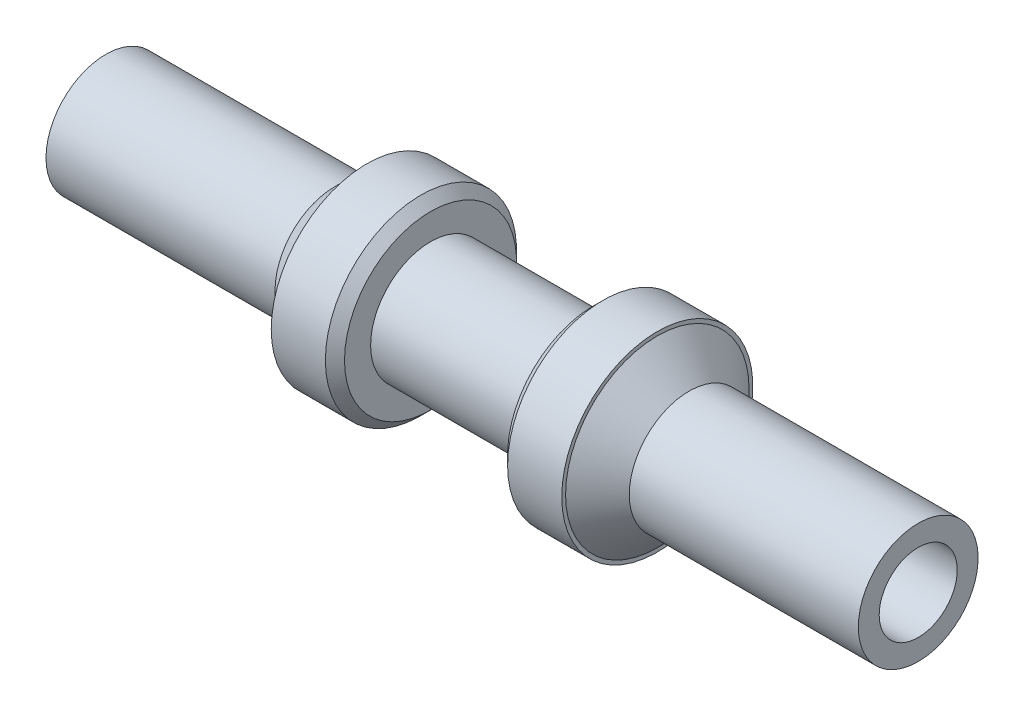
ISO-10303-21;
HEADER;
FILE_DESCRIPTION(('STEP AP214'),'2;1');
FILE_NAME('part.step','',(''),(''),'','','');
FILE_SCHEMA(('AUTOMOTIVE_DESIGN { 1 0 10303 214 1 1 1 1 }'));
ENDSEC;
DATA;
#1=APPLICATION_CONTEXT('core data for automotive mechanical design processes');
#2=APPLICATION_PROTOCOL_DEFINITION('international standard','automotive_design',2000,#1);
#3=PRODUCT_CONTEXT('',#1,'mechanical');
#4=PRODUCT('Part','Part','',(#3));
#5=PRODUCT_RELATED_PRODUCT_CATEGORY('part','',(#4));
#6=PRODUCT_DEFINITION_FORMATION('','',#4);
#7=PRODUCT_DEFINITION_CONTEXT('part definition',#1,'design');
#8=PRODUCT_DEFINITION('design','',#6,#7);
#9=PRODUCT_DEFINITION_SHAPE('','',#8);
#10=(LENGTH_UNIT() NAMED_UNIT(*) SI_UNIT(.MILLI.,.METRE.));
#11=(NAMED_UNIT(*) PLANE_ANGLE_UNIT() SI_UNIT($,.RADIAN.));
#12=(NAMED_UNIT(*) SI_UNIT($,.STERADIAN.) SOLID_ANGLE_UNIT());
#13=UNCERTAINTY_MEASURE_WITH_UNIT(LENGTH_MEASURE(1.E-05),#10,'distance_accuracy_value','');
#14=(GEOMETRIC_REPRESENTATION_CONTEXT(3) GLOBAL_UNCERTAINTY_ASSIGNED_CONTEXT((#13)) GLOBAL_UNIT_ASSIGNED_CONTEXT((#10,
#11,#12)) REPRESENTATION_CONTEXT('',''));
#15=CARTESIAN_POINT('',(0.,0.,0.));
#16=DIRECTION('',(0.,0.,1.));
#17=DIRECTION('',(1.,0.,0.));
#18=AXIS2_PLACEMENT_3D('',#15,#16,#17);
#19=CARTESIAN_POINT('',(0.,0.,0.));
#20=DIRECTION('',(-1.,0.,0.));
#21=DIRECTION('',(0.,0.,1.));
#22=AXIS2_PLACEMENT_3D('',#19,#20,#21);
#23=CYLINDRICAL_SURFACE('',#22,3.1115);
#24=CARTESIAN_POINT('',(64.77,0.,0.));
#25=DIRECTION('',(-1.,0.,0.));
#26=DIRECTION('',(0.,0.,1.));
#27=AXIS2_PLACEMENT_3D('',#24,#25,#26);
#28=CIRCLE('',#27,3.1115);
#29=CARTESIAN_POINT('',(64.77,0.,3.1115));
#30=VERTEX_POINT('',#29);
#31=EDGE_CURVE('E111',#30,#30,#28,.T.);
#32=ORIENTED_EDGE('',*,*,#31,.F.);
#33=EDGE_LOOP('',(#32));
#34=FACE_BOUND('',#33,.T.);
#35=CARTESIAN_POINT('',(0.,0.,0.));
#36=DIRECTION('',(-1.,0.,0.));
#37=DIRECTION('',(0.,0.,1.));
#38=AXIS2_PLACEMENT_3D('',#35,#36,#37);
#39=CIRCLE('',#38,3.1115);
#40=CARTESIAN_POINT('',(0.,0.,3.1115));
#41=VERTEX_POINT('',#40);
#42=EDGE_CURVE('E88',#41,#41,#39,.T.);
#43=ORIENTED_EDGE('',*,*,#42,.T.);
#44=EDGE_LOOP('',(#43));
#45=FACE_BOUND('',#44,.T.);
#46=ADVANCED_FACE('F44',(#34,#45),#23,.F.);
#47=CARTESIAN_POINT('',(0.,3.1115,0.));
#48=DIRECTION('',(1.,0.,0.));
#49=DIRECTION('',(0.,0.,-1.));
#50=AXIS2_PLACEMENT_3D('',#47,#48,#49);
#51=PLANE('',#50);
#52=ORIENTED_EDGE('',*,*,#42,.F.);
#53=EDGE_LOOP('',(#52));
#54=FACE_BOUND('',#53,.T.);
#55=CARTESIAN_POINT('',(0.,0.,0.));
#56=DIRECTION('',(-1.,0.,0.));
#57=DIRECTION('',(0.,0.,1.));
#58=AXIS2_PLACEMENT_3D('',#55,#56,#57);
#59=CIRCLE('',#58,4.7752);
#60=CARTESIAN_POINT('',(0.,0.,4.7752));
#61=VERTEX_POINT('',#60);
#62=EDGE_CURVE('E89',#61,#61,#59,.T.);
#63=ORIENTED_EDGE('',*,*,#62,.T.);
#64=EDGE_LOOP('',(#63));
#65=FACE_BOUND('',#64,.T.);
#66=ADVANCED_FACE('F121',(#54,#65),#51,.F.);
#67=CARTESIAN_POINT('',(0.,0.,0.));
#68=DIRECTION('',(-1.,0.,0.));
#69=DIRECTION('',(0.,0.,1.));
#70=AXIS2_PLACEMENT_3D('',#67,#68,#69);
#71=CYLINDRICAL_SURFACE('',#70,4.7752);
#72=CARTESIAN_POINT('',(18.2626,0.,0.));
#73=DIRECTION('',(1.,0.,0.));
#74=DIRECTION('',(0.,0.,-1.));
#75=AXIS2_PLACEMENT_3D('',#72,#73,#74);
#76=CIRCLE('',#75,4.7752);
#77=CARTESIAN_POINT('',(18.2626,0.,-4.7752));
#78=VERTEX_POINT('',#77);
#79=EDGE_CURVE('E63',#78,#78,#76,.F.);
#80=ORIENTED_EDGE('',*,*,#79,.T.);
#81=EDGE_LOOP('',(#80));
#82=FACE_BOUND('',#81,.T.);
#83=ORIENTED_EDGE('',*,*,#62,.F.);
#84=EDGE_LOOP('',(#83));
#85=FACE_BOUND('',#84,.T.);
#86=ADVANCED_FACE('F129',(#82,#85),#71,.T.);
#87=CARTESIAN_POINT('',(20.8026,4.7752,0.));
#88=DIRECTION('',(1.,0.,0.));
#89=DIRECTION('',(0.,0.,-1.));
#90=AXIS2_PLACEMENT_3D('',#87,#88,#89);
#91=PLANE('',#90);
#92=CARTESIAN_POINT('',(20.8026,0.,0.));
#93=DIRECTION('',(1.,0.,0.));
#94=DIRECTION('',(0.,0.,-1.));
#95=AXIS2_PLACEMENT_3D('',#92,#93,#94);
#96=CIRCLE('',#95,7.3152);
#97=CARTESIAN_POINT('',(20.8026,0.,-7.3152));
#98=VERTEX_POINT('',#97);
#99=EDGE_CURVE('E56',#98,#98,#96,.T.);
#100=ORIENTED_EDGE('',*,*,#99,.T.);
#101=EDGE_LOOP('',(#100));
#102=FACE_BOUND('',#101,.T.);
#103=CARTESIAN_POINT('',(20.8026,0.,0.));
#104=DIRECTION('',(-1.,0.,0.));
#105=DIRECTION('',(0.,0.,1.));
#106=AXIS2_PLACEMENT_3D('',#103,#104,#105);
#107=CIRCLE('',#106,7.62);
#108=CARTESIAN_POINT('',(20.8026,0.,7.62));
#109=VERTEX_POINT('',#108);
#110=EDGE_CURVE('E94',#109,#109,#107,.T.);
#111=ORIENTED_EDGE('',*,*,#110,.T.);
#112=EDGE_LOOP('',(#111));
#113=FACE_BOUND('',#112,.T.);
#114=ADVANCED_FACE('F133',(#102,#113),#91,.F.);
#115=CARTESIAN_POINT('',(0.,0.,0.));
#116=DIRECTION('',(-1.,0.,0.));
#117=DIRECTION('',(0.,0.,1.));
#118=AXIS2_PLACEMENT_3D('',#115,#116,#117);
#119=CYLINDRICAL_SURFACE('',#118,7.62);
#120=CARTESIAN_POINT('',(25.1206,0.,0.));
#121=DIRECTION('',(-1.,0.,0.));
#122=DIRECTION('',(0.,0.,1.));
#123=AXIS2_PLACEMENT_3D('',#120,#121,#122);
#124=CIRCLE('',#123,7.62);
#125=CARTESIAN_POINT('',(25.1206,0.,7.62));
#126=VERTEX_POINT('',#125);
#127=EDGE_CURVE('E74',#126,#126,#124,.T.);
#128=ORIENTED_EDGE('',*,*,#127,.T.);
#129=EDGE_LOOP('',(#128));
#130=FACE_BOUND('',#129,.T.);
#131=ORIENTED_EDGE('',*,*,#110,.F.);
#132=EDGE_LOOP('',(#131));
#133=FACE_BOUND('',#132,.T.);
#134=ADVANCED_FACE('F143',(#130,#133),#119,.T.);
#135=CARTESIAN_POINT('',(25.8826,7.62,0.));
#136=DIRECTION('',(-1.,0.,0.));
#137=DIRECTION('',(0.,0.,1.));
#138=AXIS2_PLACEMENT_3D('',#135,#136,#137);
#139=PLANE('',#138);
#140=CARTESIAN_POINT('',(25.8826,0.,0.));
#141=DIRECTION('',(-1.,0.,0.));
#142=DIRECTION('',(0.,0.,1.));
#143=AXIS2_PLACEMENT_3D('',#140,#141,#142);
#144=CIRCLE('',#143,6.85800000000001);
#145=CARTESIAN_POINT('',(25.8826,0.,6.85800000000001));
#146=VERTEX_POINT('',#145);
#147=EDGE_CURVE('E69',#146,#146,#144,.F.);
#148=ORIENTED_EDGE('',*,*,#147,.T.);
#149=EDGE_LOOP('',(#148));
#150=FACE_BOUND('',#149,.T.);
#151=CARTESIAN_POINT('',(25.8826,0.,0.));
#152=DIRECTION('',(-1.,0.,0.));
#153=DIRECTION('',(0.,0.,1.));
#154=AXIS2_PLACEMENT_3D('',#151,#152,#153);
#155=CIRCLE('',#154,4.7752);
#156=CARTESIAN_POINT('',(25.8826,0.,4.7752));
#157=VERTEX_POINT('',#156);
#158=EDGE_CURVE('E98',#157,#157,#155,.T.);
#159=ORIENTED_EDGE('',*,*,#158,.T.);
#160=EDGE_LOOP('',(#159));
#161=FACE_BOUND('',#160,.T.);
#162=ADVANCED_FACE('F178',(#150,#161),#139,.F.);
#163=CARTESIAN_POINT('',(0.,0.,0.));
#164=DIRECTION('',(-1.,0.,0.));
#165=DIRECTION('',(0.,0.,1.));
#166=AXIS2_PLACEMENT_3D('',#163,#164,#165);
#167=CYLINDRICAL_SURFACE('',#166,4.7752);
#168=ORIENTED_EDGE('',*,*,#158,.F.);
#169=EDGE_LOOP('',(#168));
#170=FACE_BOUND('',#169,.T.);
#171=CARTESIAN_POINT('',(38.8874,0.,0.));
#172=DIRECTION('',(-1.,0.,0.));
#173=DIRECTION('',(0.,0.,1.));
#174=AXIS2_PLACEMENT_3D('',#171,#172,#173);
#175=CIRCLE('',#174,4.7752);
#176=CARTESIAN_POINT('',(38.8874,0.,4.7752));
#177=VERTEX_POINT('',#176);
#178=EDGE_CURVE('E105',#177,#177,#175,.T.);
#179=ORIENTED_EDGE('',*,*,#178,.T.);
#180=EDGE_LOOP('',(#179));
#181=FACE_BOUND('',#180,.T.);
#182=ADVANCED_FACE('F185',(#170,#181),#167,.T.);
#183=CARTESIAN_POINT('',(38.8874,4.7752,0.));
#184=DIRECTION('',(1.,0.,0.));
#185=DIRECTION('',(0.,0.,-1.));
#186=AXIS2_PLACEMENT_3D('',#183,#184,#185);
#187=PLANE('',#186);
#188=CARTESIAN_POINT('',(38.8874,0.,0.));
#189=DIRECTION('',(1.,0.,0.));
#190=DIRECTION('',(0.,0.,-1.));
#191=AXIS2_PLACEMENT_3D('',#188,#189,#190);
#192=CIRCLE('',#191,6.85799999999999);
#193=CARTESIAN_POINT('',(38.8874,0.,-6.85799999999999));
#194=VERTEX_POINT('',#193);
#195=EDGE_CURVE('E85',#194,#194,#192,.F.);
#196=ORIENTED_EDGE('',*,*,#195,.T.);
#197=EDGE_LOOP('',(#196));
#198=FACE_BOUND('',#197,.T.);
#199=ORIENTED_EDGE('',*,*,#178,.F.);
#200=EDGE_LOOP('',(#199));
#201=FACE_BOUND('',#200,.T.);
#202=ADVANCED_FACE('F190',(#198,#201),#187,.F.);
#203=CARTESIAN_POINT('',(0.,0.,0.));
#204=DIRECTION('',(-1.,0.,0.));
#205=DIRECTION('',(0.,0.,1.));
#206=AXIS2_PLACEMENT_3D('',#203,#204,#205);
#207=CYLINDRICAL_SURFACE('',#206,7.62);
#208=CARTESIAN_POINT('',(39.6494,0.,0.));
#209=DIRECTION('',(1.,0.,0.));
#210=DIRECTION('',(0.,0.,-1.));
#211=AXIS2_PLACEMENT_3D('',#208,#209,#210);
#212=CIRCLE('',#211,7.62);
#213=CARTESIAN_POINT('',(39.6494,0.,-7.62));
#214=VERTEX_POINT('',#213);
#215=EDGE_CURVE('E80',#214,#214,#212,.T.);
#216=ORIENTED_EDGE('',*,*,#215,.T.);
#217=EDGE_LOOP('',(#216));
#218=FACE_BOUND('',#217,.T.);
#219=CARTESIAN_POINT('',(43.9674,0.,0.));
#220=DIRECTION('',(-1.,0.,0.));
#221=DIRECTION('',(0.,0.,1.));
#222=AXIS2_PLACEMENT_3D('',#219,#220,#221);
#223=CIRCLE('',#222,7.62);
#224=CARTESIAN_POINT('',(43.9674,0.,7.62));
#225=VERTEX_POINT('',#224);
#226=EDGE_CURVE('E106',#225,#225,#223,.T.);
#227=ORIENTED_EDGE('',*,*,#226,.T.);
#228=EDGE_LOOP('',(#227));
#229=FACE_BOUND('',#228,.T.);
#230=ADVANCED_FACE('F195',(#218,#229),#207,.T.);
#231=CARTESIAN_POINT('',(43.9674,7.62,0.));
#232=DIRECTION('',(-1.,0.,0.));
#233=DIRECTION('',(0.,0.,1.));
#234=AXIS2_PLACEMENT_3D('',#231,#232,#233);
#235=PLANE('',#234);
#236=CARTESIAN_POINT('',(43.9674,0.,0.));
#237=DIRECTION('',(-1.,0.,0.));
#238=DIRECTION('',(0.,0.,1.));
#239=AXIS2_PLACEMENT_3D('',#236,#237,#238);
#240=CIRCLE('',#239,7.31520000000004);
#241=CARTESIAN_POINT('',(43.9674,0.,7.31520000000004));
#242=VERTEX_POINT('',#241);
#243=EDGE_CURVE('E53',#242,#242,#240,.T.);
#244=ORIENTED_EDGE('',*,*,#243,.T.);
#245=EDGE_LOOP('',(#244));
#246=FACE_BOUND('',#245,.T.);
#247=ORIENTED_EDGE('',*,*,#226,.F.);
#248=EDGE_LOOP('',(#247));
#249=FACE_BOUND('',#248,.T.);
#250=ADVANCED_FACE('F198',(#246,#249),#235,.F.);
#251=CARTESIAN_POINT('',(0.,0.,0.));
#252=DIRECTION('',(-1.,0.,0.));
#253=DIRECTION('',(0.,0.,1.));
#254=AXIS2_PLACEMENT_3D('',#251,#252,#253);
#255=CYLINDRICAL_SURFACE('',#254,4.7752);
#256=CARTESIAN_POINT('',(46.5074,0.,0.));
#257=DIRECTION('',(-1.,0.,0.));
#258=DIRECTION('',(0.,0.,1.));
#259=AXIS2_PLACEMENT_3D('',#256,#257,#258);
#260=CIRCLE('',#259,4.7752);
#261=CARTESIAN_POINT('',(46.5074,0.,4.7752));
#262=VERTEX_POINT('',#261);
#263=EDGE_CURVE('E10',#262,#262,#260,.F.);
#264=ORIENTED_EDGE('',*,*,#263,.T.);
#265=EDGE_LOOP('',(#264));
#266=FACE_BOUND('',#265,.T.);
#267=CARTESIAN_POINT('',(64.77,0.,0.));
#268=DIRECTION('',(-1.,0.,0.));
#269=DIRECTION('',(0.,0.,1.));
#270=AXIS2_PLACEMENT_3D('',#267,#268,#269);
#271=CIRCLE('',#270,4.7752);
#272=CARTESIAN_POINT('',(64.77,0.,4.7752));
#273=VERTEX_POINT('',#272);
#274=EDGE_CURVE('E109',#273,#273,#271,.T.);
#275=ORIENTED_EDGE('',*,*,#274,.T.);
#276=EDGE_LOOP('',(#275));
#277=FACE_BOUND('',#276,.T.);
#278=ADVANCED_FACE('F199',(#266,#277),#255,.T.);
#279=CARTESIAN_POINT('',(64.77,4.7752,0.));
#280=DIRECTION('',(-1.,0.,0.));
#281=DIRECTION('',(0.,0.,1.));
#282=AXIS2_PLACEMENT_3D('',#279,#280,#281);
#283=PLANE('',#282);
#284=ORIENTED_EDGE('',*,*,#274,.F.);
#285=EDGE_LOOP('',(#284));
#286=FACE_BOUND('',#285,.T.);
#287=ORIENTED_EDGE('',*,*,#31,.T.);
#288=EDGE_LOOP('',(#287));
#289=FACE_BOUND('',#288,.T.);
#290=ADVANCED_FACE('F118',(#286,#289),#283,.F.);
#291=CARTESIAN_POINT('',(38.8874,0.,0.));
#292=DIRECTION('',(1.,0.,0.));
#293=DIRECTION('',(0.,0.,-1.));
#294=AXIS2_PLACEMENT_3D('',#291,#292,#293);
#295=CONICAL_SURFACE('',#294,6.85799999999999,0.785398163397447);
#296=CARTESIAN_POINT('',(39.6494,0.,-7.62));
#297=CARTESIAN_POINT('',(39.6414625,0.,-7.6120625));
#298=CARTESIAN_POINT('',(39.633525,0.,-7.604125));
#299=CARTESIAN_POINT('',(39.61765,0.,-7.58825));
#300=CARTESIAN_POINT('',(39.6097125,0.,-7.5803125));
#301=CARTESIAN_POINT('',(39.5938375,0.,-7.5644375));
#302=CARTESIAN_POINT('',(39.5859,0.,-7.5565));
#303=CARTESIAN_POINT('',(39.570025,0.,-7.540625));
#304=CARTESIAN_POINT('',(39.5620875,0.,-7.5326875));
#305=CARTESIAN_POINT('',(39.5462125,0.,-7.5168125));
#306=CARTESIAN_POINT('',(39.538275,0.,-7.50887499999999));
#307=CARTESIAN_POINT('',(39.5224,0.,-7.49299999999999));
#308=CARTESIAN_POINT('',(39.5144625,0.,-7.4850625));
#309=CARTESIAN_POINT('',(39.4985875,0.,-7.46918749999999));
#310=CARTESIAN_POINT('',(39.49065,0.,-7.46124999999999));
#311=CARTESIAN_POINT('',(39.474775,0.,-7.44537499999999));
#312=CARTESIAN_POINT('',(39.4668375,0.,-7.43743749999999));
#313=CARTESIAN_POINT('',(39.4509625,0.,-7.42156249999999));
#314=CARTESIAN_POINT('',(39.443025,0.,-7.41362499999999));
#315=CARTESIAN_POINT('',(39.42715,0.,-7.39774999999999));
#316=CARTESIAN_POINT('',(39.4192125,0.,-7.38981249999999));
#317=CARTESIAN_POINT('',(39.4033375,0.,-7.37393749999999));
#318=CARTESIAN_POINT('',(39.3954,0.,-7.36599999999999));
#319=CARTESIAN_POINT('',(39.379525,0.,-7.35012499999999));
#320=CARTESIAN_POINT('',(39.3715875,0.,-7.34218749999999));
#321=CARTESIAN_POINT('',(39.3557125,0.,-7.32631249999999));
#322=CARTESIAN_POINT('',(39.347775,0.,-7.31837499999999));
#323=CARTESIAN_POINT('',(39.3319,0.,-7.30249999999999));
#324=CARTESIAN_POINT('',(39.3239625,0.,-7.29456249999999));
#325=CARTESIAN_POINT('',(39.3080875,0.,-7.27868749999999));
#326=CARTESIAN_POINT('',(39.30015,0.,-7.27074999999999));
#327=CARTESIAN_POINT('',(39.284275,0.,-7.25487499999999));
#328=CARTESIAN_POINT('',(39.2763375,0.,-7.24693749999999));
#329=CARTESIAN_POINT('',(39.2604625,0.,-7.23106249999999));
#330=CARTESIAN_POINT('',(39.252525,0.,-7.22312499999999));
#331=CARTESIAN_POINT('',(39.23665,0.,-7.20724999999999));
#332=CARTESIAN_POINT('',(39.2287125,0.,-7.19931249999999));
#333=CARTESIAN_POINT('',(39.2128375,0.,-7.18343749999999));
#334=CARTESIAN_POINT('',(39.2049,0.,-7.17549999999999));
#335=CARTESIAN_POINT('',(39.189025,0.,-7.15962499999999));
#336=CARTESIAN_POINT('',(39.1810875,0.,-7.15168749999999));
#337=CARTESIAN_POINT('',(39.1652125,0.,-7.13581249999999));
#338=CARTESIAN_POINT('',(39.157275,0.,-7.12787499999999));
#339=CARTESIAN_POINT('',(39.1414,0.,-7.11199999999999));
#340=CARTESIAN_POINT('',(39.1334625,0.,-7.10406249999999));
#341=CARTESIAN_POINT('',(39.1175875,0.,-7.08818749999999));
#342=CARTESIAN_POINT('',(39.10965,0.,-7.08024999999999));
#343=CARTESIAN_POINT('',(39.093775,0.,-7.06437499999999));
#344=CARTESIAN_POINT('',(39.0858375,0.,-7.05643749999999));
#345=CARTESIAN_POINT('',(39.0699625,0.,-7.04056249999999));
#346=CARTESIAN_POINT('',(39.062025,0.,-7.03262499999999));
#347=CARTESIAN_POINT('',(39.04615,0.,-7.01674999999999));
#348=CARTESIAN_POINT('',(39.0382125,0.,-7.00881249999999));
#349=CARTESIAN_POINT('',(39.0223375,0.,-6.99293749999999));
#350=CARTESIAN_POINT('',(39.0144,0.,-6.98499999999999));
#351=CARTESIAN_POINT('',(38.998525,0.,-6.96912499999999));
#352=CARTESIAN_POINT('',(38.9905875,0.,-6.96118749999999));
#353=CARTESIAN_POINT('',(38.9747125,0.,-6.94531249999999));
#354=CARTESIAN_POINT('',(38.966775,0.,-6.93737499999999));
#355=CARTESIAN_POINT('',(38.9509,0.,-6.92149999999999));
#356=CARTESIAN_POINT('',(38.9429625,0.,-6.91356249999999));
#357=CARTESIAN_POINT('',(38.9270875,0.,-6.89768749999999));
#358=CARTESIAN_POINT('',(38.91915,0.,-6.88974999999999));
#359=CARTESIAN_POINT('',(38.903275,0.,-6.87387499999999));
#360=CARTESIAN_POINT('',(38.8953375,0.,-6.86593749999999));
#361=CARTESIAN_POINT('',(38.8874,0.,-6.85799999999999));
#362=B_SPLINE_CURVE_WITH_KNOTS('',3,(#296,#297,#298,#299,#300,#301,#302,#303,#304,#305,#306,
#307,#308,#309,#310,#311,#312,#313,#314,#315,#316,#317,#318,#319,#320,#321,#322,#323,#324,#325,
#326,#327,#328,#329,#330,#331,#332,#333,#334,#335,#336,#337,#338,#339,#340,#341,#342,#343,#344,
#345,#346,#347,#348,#349,#350,#351,#352,#353,#354,#355,#356,#357,#358,#359,#360,#361),
.UNSPECIFIED.,.F.,.F.,(4,2,2,2,2,2,2,2,2,2,2,2,2,2,2,2,2,2,2,2,2,2,2,2,2,2,2,2,2,2,2,2,4),(0.,
0.033675960454008,0.0673519209080161,0.101027881362029,0.134703841816037,0.168379802270045,
0.202055762724058,0.235731723178066,0.269407683632079,0.303083644086087,0.336759604540095,
0.370435564994108,0.404111525448116,0.437787485902124,0.471463446356137,0.505139406810145,
0.538815367264158,0.572491327718166,0.606167288172174,0.639843248626187,0.673519209080195,
0.707195169534203,0.740871129988216,0.774547090442224,0.808223050896236,0.841899011350244,
0.875574971804252,0.909250932258265,0.942926892712273,0.976602853166281,1.01027881362029,
1.0439547740743,1.07763073452831),.UNSPECIFIED.);
#363=EDGE_CURVE('BSEAM150',#214,#194,#362,.T.);
#364=ORIENTED_EDGE('',*,*,#215,.F.);
#365=ORIENTED_EDGE('',*,*,#195,.F.);
#366=ORIENTED_EDGE('',*,*,#363,.T.);
#367=ORIENTED_EDGE('',*,*,#363,.F.);
#368=EDGE_LOOP('',(#364,#366,#365,#367));
#369=FACE_BOUND('',#368,.T.);
#370=ADVANCED_FACE('F150',(#369),#295,.T.);
#371=CARTESIAN_POINT('',(25.1206,0.,0.));
#372=DIRECTION('',(-1.,0.,0.));
#373=DIRECTION('',(0.,0.,1.));
#374=AXIS2_PLACEMENT_3D('',#371,#372,#373);
#375=CONICAL_SURFACE('',#374,7.62,0.785398163397446);
#376=ORIENTED_EDGE('',*,*,#147,.F.);
#377=EDGE_LOOP('',(#376));
#378=FACE_BOUND('',#377,.T.);
#379=ORIENTED_EDGE('',*,*,#127,.F.);
#380=EDGE_LOOP('',(#379));
#381=FACE_BOUND('',#380,.T.);
#382=ADVANCED_FACE('F153',(#378,#381),#375,.T.);
#383=CARTESIAN_POINT('',(18.2626,0.,0.));
#384=DIRECTION('',(1.,0.,0.));
#385=DIRECTION('',(0.,0.,-1.));
#386=AXIS2_PLACEMENT_3D('',#383,#384,#385);
#387=CONICAL_SURFACE('',#386,4.7752,0.785398163397442);
#388=ORIENTED_EDGE('',*,*,#99,.F.);
#389=EDGE_LOOP('',(#388));
#390=FACE_BOUND('',#389,.T.);
#391=ORIENTED_EDGE('',*,*,#79,.F.);
#392=EDGE_LOOP('',(#391));
#393=FACE_BOUND('',#392,.T.);
#394=ADVANCED_FACE('F158',(#390,#393),#387,.T.);
#395=CARTESIAN_POINT('',(43.9674,0.,0.));
#396=DIRECTION('',(-1.,0.,0.));
#397=DIRECTION('',(0.,0.,1.));
#398=AXIS2_PLACEMENT_3D('',#395,#396,#397);
#399=CONICAL_SURFACE('',#398,7.31520000000004,0.785398163397454);
#400=ORIENTED_EDGE('',*,*,#263,.F.);
#401=EDGE_LOOP('',(#400));
#402=FACE_BOUND('',#401,.T.);
#403=ORIENTED_EDGE('',*,*,#243,.F.);
#404=EDGE_LOOP('',(#403));
#405=FACE_BOUND('',#404,.T.);
#406=ADVANCED_FACE('F48',(#402,#405),#399,.T.);
#407=CLOSED_SHELL('',(#46,#66,#86,#114,#134,#162,#182,#202,#230,#250,#278,#290,#370,#382,#394,#406));
#408=MANIFOLD_SOLID_BREP('B2',#407);
#409=ADVANCED_BREP_SHAPE_REPRESENTATION('',(#18,#408),#14);
#410=SHAPE_DEFINITION_REPRESENTATION(#9,#409);
ENDSEC;
END-ISO-10303-21;
